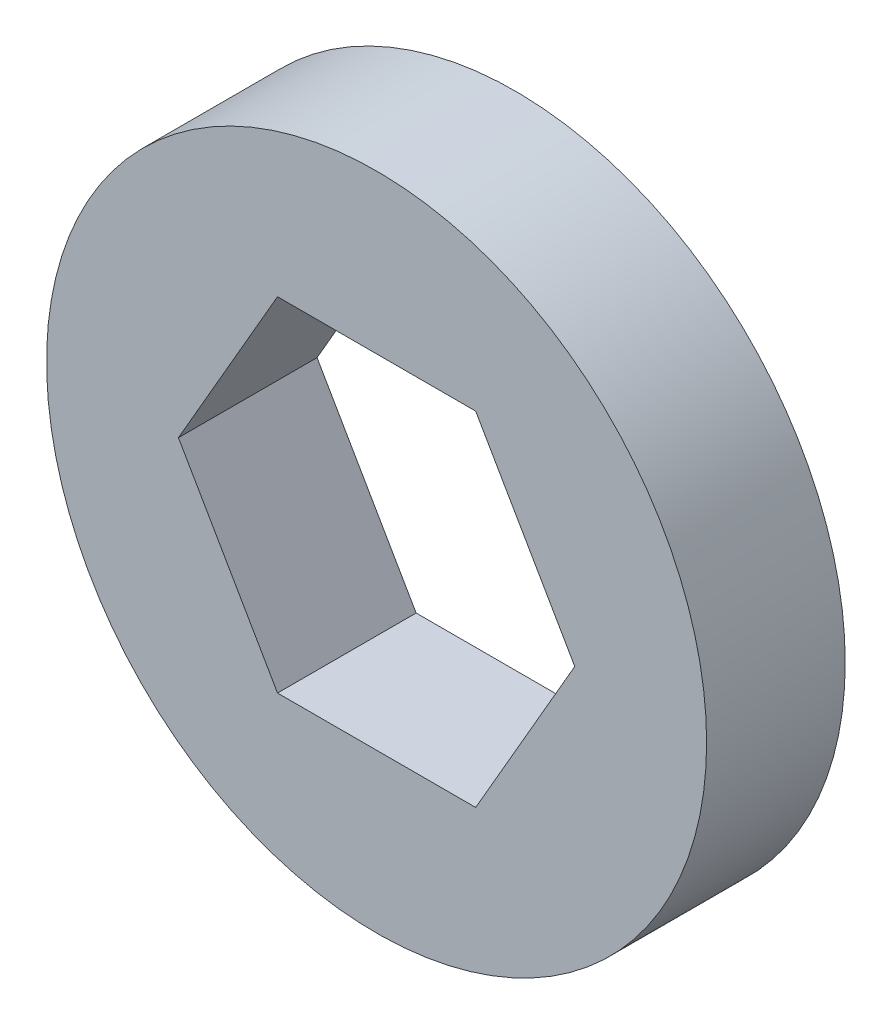
ISO-10303-21;
HEADER;
FILE_DESCRIPTION(('STEP AP214'),'2;1');
FILE_NAME('part.step','',(''),(''),'','','');
FILE_SCHEMA(('AUTOMOTIVE_DESIGN { 1 0 10303 214 1 1 1 1 }'));
ENDSEC;
DATA;
#1=APPLICATION_CONTEXT('core data for automotive mechanical design processes');
#2=APPLICATION_PROTOCOL_DEFINITION('international standard','automotive_design',2000,#1);
#3=PRODUCT_CONTEXT('',#1,'mechanical');
#4=PRODUCT('Part','Part','',(#3));
#5=PRODUCT_RELATED_PRODUCT_CATEGORY('part','',(#4));
#6=PRODUCT_DEFINITION_FORMATION('','',#4);
#7=PRODUCT_DEFINITION_CONTEXT('part definition',#1,'design');
#8=PRODUCT_DEFINITION('design','',#6,#7);
#9=PRODUCT_DEFINITION_SHAPE('','',#8);
#10=(LENGTH_UNIT() NAMED_UNIT(*) SI_UNIT(.MILLI.,.METRE.));
#11=(NAMED_UNIT(*) PLANE_ANGLE_UNIT() SI_UNIT($,.RADIAN.));
#12=(NAMED_UNIT(*) SI_UNIT($,.STERADIAN.) SOLID_ANGLE_UNIT());
#13=UNCERTAINTY_MEASURE_WITH_UNIT(LENGTH_MEASURE(1.E-05),#10,'distance_accuracy_value','');
#14=(GEOMETRIC_REPRESENTATION_CONTEXT(3) GLOBAL_UNCERTAINTY_ASSIGNED_CONTEXT((#13)) GLOBAL_UNIT_ASSIGNED_CONTEXT((#10,
#11,#12)) REPRESENTATION_CONTEXT('',''));
#15=CARTESIAN_POINT('',(0.,0.,0.));
#16=DIRECTION('',(0.,0.,1.));
#17=DIRECTION('',(1.,0.,0.));
#18=AXIS2_PLACEMENT_3D('',#15,#16,#17);
#19=CARTESIAN_POINT('',(0.,0.,5.334));
#20=DIRECTION('',(0.,0.,1.));
#21=DIRECTION('',(1.,0.,0.));
#22=AXIS2_PLACEMENT_3D('',#19,#20,#21);
#23=PLANE('',#22);
#24=CARTESIAN_POINT('',(0.,0.,5.334));
#25=DIRECTION('',(0.,0.,1.));
#26=DIRECTION('',(1.,0.,0.));
#27=AXIS2_PLACEMENT_3D('',#24,#25,#26);
#28=CIRCLE('',#27,12.7);
#29=CARTESIAN_POINT('',(12.7,0.,5.334));
#30=VERTEX_POINT('',#29);
#31=EDGE_CURVE('E11',#30,#30,#28,.T.);
#32=ORIENTED_EDGE('',*,*,#31,.T.);
#33=EDGE_LOOP('',(#32));
#34=FACE_BOUND('',#33,.T.);
#35=DIRECTION('',(0.5,0.866025403784438,0.));
#36=VECTOR('',#35,1.);
#37=CARTESIAN_POINT('',(3.81282117772829,-6.604,5.334));
#38=LINE('',#37,#36);
#39=CARTESIAN_POINT('',(3.81282117772829,-6.604,5.334));
#40=VERTEX_POINT('',#39);
#41=CARTESIAN_POINT('',(7.62564235545658,0.,5.334));
#42=VERTEX_POINT('',#41);
#43=EDGE_CURVE('E98',#40,#42,#38,.T.);
#44=ORIENTED_EDGE('',*,*,#43,.F.);
#45=DIRECTION('',(1.,0.,0.));
#46=VECTOR('',#45,1.);
#47=CARTESIAN_POINT('',(-3.81282117772829,-6.604,5.334));
#48=LINE('',#47,#46);
#49=CARTESIAN_POINT('',(-3.81282117772829,-6.604,5.334));
#50=VERTEX_POINT('',#49);
#51=EDGE_CURVE('E90',#50,#40,#48,.T.);
#52=ORIENTED_EDGE('',*,*,#51,.F.);
#53=DIRECTION('',(0.5,-0.866025403784439,0.));
#54=VECTOR('',#53,1.);
#55=CARTESIAN_POINT('',(-7.62564235545658,0.,5.334));
#56=LINE('',#55,#54);
#57=CARTESIAN_POINT('',(-7.62564235545658,0.,5.334));
#58=VERTEX_POINT('',#57);
#59=EDGE_CURVE('E118',#58,#50,#56,.T.);
#60=ORIENTED_EDGE('',*,*,#59,.F.);
#61=DIRECTION('',(-0.5,-0.866025403784438,0.));
#62=VECTOR('',#61,1.);
#63=CARTESIAN_POINT('',(-3.81282117772829,6.604,5.334));
#64=LINE('',#63,#62);
#65=CARTESIAN_POINT('',(-3.81282117772829,6.604,5.334));
#66=VERTEX_POINT('',#65);
#67=EDGE_CURVE('E116',#66,#58,#64,.T.);
#68=ORIENTED_EDGE('',*,*,#67,.F.);
#69=DIRECTION('',(-1.,0.,0.));
#70=VECTOR('',#69,1.);
#71=CARTESIAN_POINT('',(3.81282117772829,6.604,5.334));
#72=LINE('',#71,#70);
#73=CARTESIAN_POINT('',(3.81282117772829,6.604,5.334));
#74=VERTEX_POINT('',#73);
#75=EDGE_CURVE('E112',#74,#66,#72,.T.);
#76=ORIENTED_EDGE('',*,*,#75,.F.);
#77=DIRECTION('',(-0.5,0.866025403784439,0.));
#78=VECTOR('',#77,1.);
#79=CARTESIAN_POINT('',(7.62564235545658,0.,5.334));
#80=LINE('',#79,#78);
#81=EDGE_CURVE('E110',#42,#74,#80,.T.);
#82=ORIENTED_EDGE('',*,*,#81,.F.);
#83=EDGE_LOOP('',(#44,#52,#60,#68,#76,#82));
#84=FACE_BOUND('',#83,.T.);
#85=ADVANCED_FACE('F37',(#34,#84),#23,.T.);
#86=CARTESIAN_POINT('',(0.,0.,0.));
#87=DIRECTION('',(0.,0.,1.));
#88=DIRECTION('',(1.,0.,0.));
#89=AXIS2_PLACEMENT_3D('',#86,#87,#88);
#90=PLANE('',#89);
#91=CARTESIAN_POINT('',(0.,0.,0.));
#92=DIRECTION('',(0.,0.,1.));
#93=DIRECTION('',(1.,0.,0.));
#94=AXIS2_PLACEMENT_3D('',#91,#92,#93);
#95=CIRCLE('',#94,12.7);
#96=CARTESIAN_POINT('',(12.7,0.,0.));
#97=VERTEX_POINT('',#96);
#98=EDGE_CURVE('E41',#97,#97,#95,.T.);
#99=ORIENTED_EDGE('',*,*,#98,.F.);
#100=EDGE_LOOP('',(#99));
#101=FACE_BOUND('',#100,.T.);
#102=DIRECTION('',(1.,0.,0.));
#103=VECTOR('',#102,1.);
#104=CARTESIAN_POINT('',(-3.81282117772829,-6.604,0.));
#105=LINE('',#104,#103);
#106=CARTESIAN_POINT('',(-3.81282117772829,-6.604,0.));
#107=VERTEX_POINT('',#106);
#108=CARTESIAN_POINT('',(3.81282117772829,-6.604,0.));
#109=VERTEX_POINT('',#108);
#110=EDGE_CURVE('E60',#107,#109,#105,.T.);
#111=ORIENTED_EDGE('',*,*,#110,.T.);
#112=DIRECTION('',(0.5,0.866025403784438,0.));
#113=VECTOR('',#112,1.);
#114=CARTESIAN_POINT('',(3.81282117772829,-6.604,0.));
#115=LINE('',#114,#113);
#116=CARTESIAN_POINT('',(7.62564235545658,0.,0.));
#117=VERTEX_POINT('',#116);
#118=EDGE_CURVE('E105',#109,#117,#115,.T.);
#119=ORIENTED_EDGE('',*,*,#118,.T.);
#120=DIRECTION('',(-0.5,0.866025403784439,0.));
#121=VECTOR('',#120,1.);
#122=CARTESIAN_POINT('',(7.62564235545658,0.,0.));
#123=LINE('',#122,#121);
#124=CARTESIAN_POINT('',(3.81282117772829,6.604,0.));
#125=VERTEX_POINT('',#124);
#126=EDGE_CURVE('E122',#117,#125,#123,.T.);
#127=ORIENTED_EDGE('',*,*,#126,.T.);
#128=DIRECTION('',(-1.,0.,0.));
#129=VECTOR('',#128,1.);
#130=CARTESIAN_POINT('',(3.81282117772829,6.604,0.));
#131=LINE('',#130,#129);
#132=CARTESIAN_POINT('',(-3.81282117772829,6.604,0.));
#133=VERTEX_POINT('',#132);
#134=EDGE_CURVE('E125',#125,#133,#131,.T.);
#135=ORIENTED_EDGE('',*,*,#134,.T.);
#136=DIRECTION('',(-0.5,-0.866025403784438,0.));
#137=VECTOR('',#136,1.);
#138=CARTESIAN_POINT('',(-3.81282117772829,6.604,0.));
#139=LINE('',#138,#137);
#140=CARTESIAN_POINT('',(-7.62564235545658,0.,0.));
#141=VERTEX_POINT('',#140);
#142=EDGE_CURVE('E128',#133,#141,#139,.T.);
#143=ORIENTED_EDGE('',*,*,#142,.T.);
#144=DIRECTION('',(0.5,-0.866025403784439,0.));
#145=VECTOR('',#144,1.);
#146=CARTESIAN_POINT('',(-7.62564235545658,0.,0.));
#147=LINE('',#146,#145);
#148=EDGE_CURVE('E99',#141,#107,#147,.T.);
#149=ORIENTED_EDGE('',*,*,#148,.T.);
#150=EDGE_LOOP('',(#111,#119,#127,#135,#143,#149));
#151=FACE_BOUND('',#150,.T.);
#152=ADVANCED_FACE('F145',(#101,#151),#90,.F.);
#153=CARTESIAN_POINT('',(0.,0.,5.334));
#154=DIRECTION('',(0.,0.,-1.));
#155=DIRECTION('',(-1.,0.,0.));
#156=AXIS2_PLACEMENT_3D('',#153,#154,#155);
#157=CYLINDRICAL_SURFACE('',#156,12.7);
#158=ORIENTED_EDGE('',*,*,#31,.F.);
#159=EDGE_LOOP('',(#158));
#160=FACE_BOUND('',#159,.T.);
#161=ORIENTED_EDGE('',*,*,#98,.T.);
#162=EDGE_LOOP('',(#161));
#163=FACE_BOUND('',#162,.T.);
#164=ADVANCED_FACE('F39',(#160,#163),#157,.T.);
#165=CARTESIAN_POINT('',(-3.81282117772829,-6.604,5.334));
#166=DIRECTION('',(0.,1.,0.));
#167=DIRECTION('',(0.,0.,1.));
#168=AXIS2_PLACEMENT_3D('',#165,#166,#167);
#169=PLANE('',#168);
#170=ORIENTED_EDGE('',*,*,#110,.F.);
#171=DIRECTION('',(0.,0.,-1.));
#172=VECTOR('',#171,1.);
#173=CARTESIAN_POINT('',(-3.81282117772829,-6.604,5.334));
#174=LINE('',#173,#172);
#175=EDGE_CURVE('E94',#50,#107,#174,.T.);
#176=ORIENTED_EDGE('',*,*,#175,.F.);
#177=ORIENTED_EDGE('',*,*,#51,.T.);
#178=DIRECTION('',(0.,0.,-1.));
#179=VECTOR('',#178,1.);
#180=CARTESIAN_POINT('',(3.81282117772829,-6.604,5.334));
#181=LINE('',#180,#179);
#182=EDGE_CURVE('E93',#40,#109,#181,.T.);
#183=ORIENTED_EDGE('',*,*,#182,.T.);
#184=EDGE_LOOP('',(#170,#176,#177,#183));
#185=FACE_BOUND('',#184,.T.);
#186=ADVANCED_FACE('F92',(#185),#169,.T.);
#187=CARTESIAN_POINT('',(3.81282117772829,-6.604,5.334));
#188=DIRECTION('',(-0.866025403784439,0.5,0.));
#189=DIRECTION('',(-0.5,-0.866025403784439,0.));
#190=AXIS2_PLACEMENT_3D('',#187,#188,#189);
#191=PLANE('',#190);
#192=ORIENTED_EDGE('',*,*,#118,.F.);
#193=ORIENTED_EDGE('',*,*,#182,.F.);
#194=ORIENTED_EDGE('',*,*,#43,.T.);
#195=DIRECTION('',(0.,0.,-1.));
#196=VECTOR('',#195,1.);
#197=CARTESIAN_POINT('',(7.62564235545658,0.,5.334));
#198=LINE('',#197,#196);
#199=EDGE_CURVE('E106',#42,#117,#198,.T.);
#200=ORIENTED_EDGE('',*,*,#199,.T.);
#201=EDGE_LOOP('',(#192,#193,#194,#200));
#202=FACE_BOUND('',#201,.T.);
#203=ADVANCED_FACE('F102',(#202),#191,.T.);
#204=CARTESIAN_POINT('',(7.62564235545658,0.,5.334));
#205=DIRECTION('',(-0.866025403784439,-0.5,0.));
#206=DIRECTION('',(0.5,-0.866025403784439,0.));
#207=AXIS2_PLACEMENT_3D('',#204,#205,#206);
#208=PLANE('',#207);
#209=ORIENTED_EDGE('',*,*,#126,.F.);
#210=ORIENTED_EDGE('',*,*,#199,.F.);
#211=ORIENTED_EDGE('',*,*,#81,.T.);
#212=DIRECTION('',(0.,0.,-1.));
#213=VECTOR('',#212,1.);
#214=CARTESIAN_POINT('',(3.81282117772829,6.604,5.334));
#215=LINE('',#214,#213);
#216=EDGE_CURVE('E137',#74,#125,#215,.T.);
#217=ORIENTED_EDGE('',*,*,#216,.T.);
#218=EDGE_LOOP('',(#209,#210,#211,#217));
#219=FACE_BOUND('',#218,.T.);
#220=ADVANCED_FACE('F141',(#219),#208,.T.);
#221=CARTESIAN_POINT('',(3.81282117772829,6.604,5.334));
#222=DIRECTION('',(0.,-1.,0.));
#223=DIRECTION('',(1.,0.,0.));
#224=AXIS2_PLACEMENT_3D('',#221,#222,#223);
#225=PLANE('',#224);
#226=ORIENTED_EDGE('',*,*,#134,.F.);
#227=ORIENTED_EDGE('',*,*,#216,.F.);
#228=ORIENTED_EDGE('',*,*,#75,.T.);
#229=DIRECTION('',(0.,0.,-1.));
#230=VECTOR('',#229,1.);
#231=CARTESIAN_POINT('',(-3.81282117772829,6.604,5.334));
#232=LINE('',#231,#230);
#233=EDGE_CURVE('E135',#66,#133,#232,.T.);
#234=ORIENTED_EDGE('',*,*,#233,.T.);
#235=EDGE_LOOP('',(#226,#227,#228,#234));
#236=FACE_BOUND('',#235,.T.);
#237=ADVANCED_FACE('F153',(#236),#225,.T.);
#238=CARTESIAN_POINT('',(-3.81282117772829,6.604,5.334));
#239=DIRECTION('',(0.866025403784439,-0.5,0.));
#240=DIRECTION('',(0.5,0.866025403784439,0.));
#241=AXIS2_PLACEMENT_3D('',#238,#239,#240);
#242=PLANE('',#241);
#243=ORIENTED_EDGE('',*,*,#142,.F.);
#244=ORIENTED_EDGE('',*,*,#233,.F.);
#245=ORIENTED_EDGE('',*,*,#67,.T.);
#246=DIRECTION('',(0.,0.,-1.));
#247=VECTOR('',#246,1.);
#248=CARTESIAN_POINT('',(-7.62564235545658,0.,5.334));
#249=LINE('',#248,#247);
#250=EDGE_CURVE('E52',#58,#141,#249,.T.);
#251=ORIENTED_EDGE('',*,*,#250,.T.);
#252=EDGE_LOOP('',(#243,#244,#245,#251));
#253=FACE_BOUND('',#252,.T.);
#254=ADVANCED_FACE('F151',(#253),#242,.T.);
#255=CARTESIAN_POINT('',(-7.62564235545658,0.,5.334));
#256=DIRECTION('',(0.866025403784439,0.5,0.));
#257=DIRECTION('',(-0.5,0.866025403784439,0.));
#258=AXIS2_PLACEMENT_3D('',#255,#256,#257);
#259=PLANE('',#258);
#260=ORIENTED_EDGE('',*,*,#148,.F.);
#261=ORIENTED_EDGE('',*,*,#250,.F.);
#262=ORIENTED_EDGE('',*,*,#59,.T.);
#263=ORIENTED_EDGE('',*,*,#175,.T.);
#264=EDGE_LOOP('',(#260,#261,#262,#263));
#265=FACE_BOUND('',#264,.T.);
#266=ADVANCED_FACE('F147',(#265),#259,.T.);
#267=CLOSED_SHELL('',(#85,#152,#164,#186,#203,#220,#237,#254,#266));
#268=MANIFOLD_SOLID_BREP('B2',#267);
#269=ADVANCED_BREP_SHAPE_REPRESENTATION('',(#18,#268),#14);
#270=SHAPE_DEFINITION_REPRESENTATION(#9,#269);
ENDSEC;
END-ISO-10303-21;
